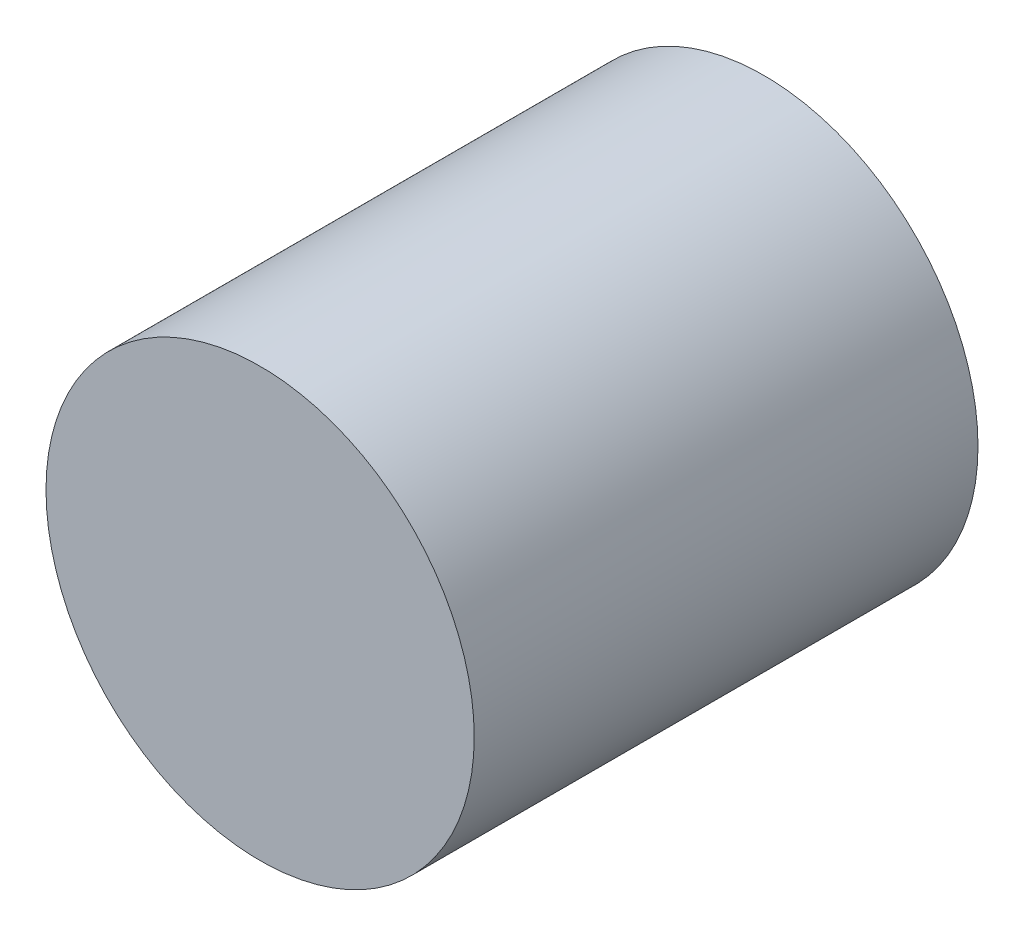
ISO-10303-21;
HEADER;
FILE_DESCRIPTION(('STEP AP214'),'2;1');
FILE_NAME('part.step','',(''),(''),'','','');
FILE_SCHEMA(('AUTOMOTIVE_DESIGN { 1 0 10303 214 1 1 1 1 }'));
ENDSEC;
DATA;
#1=APPLICATION_CONTEXT('core data for automotive mechanical design processes');
#2=APPLICATION_PROTOCOL_DEFINITION('international standard','automotive_design',2000,#1);
#3=PRODUCT_CONTEXT('',#1,'mechanical');
#4=PRODUCT('Part','Part','',(#3));
#5=PRODUCT_RELATED_PRODUCT_CATEGORY('part','',(#4));
#6=PRODUCT_DEFINITION_FORMATION('','',#4);
#7=PRODUCT_DEFINITION_CONTEXT('part definition',#1,'design');
#8=PRODUCT_DEFINITION('design','',#6,#7);
#9=PRODUCT_DEFINITION_SHAPE('','',#8);
#10=(LENGTH_UNIT() NAMED_UNIT(*) SI_UNIT(.MILLI.,.METRE.));
#11=(NAMED_UNIT(*) PLANE_ANGLE_UNIT() SI_UNIT($,.RADIAN.));
#12=(NAMED_UNIT(*) SI_UNIT($,.STERADIAN.) SOLID_ANGLE_UNIT());
#13=UNCERTAINTY_MEASURE_WITH_UNIT(LENGTH_MEASURE(1.E-05),#10,'distance_accuracy_value','');
#14=(GEOMETRIC_REPRESENTATION_CONTEXT(3) GLOBAL_UNCERTAINTY_ASSIGNED_CONTEXT((#13)) GLOBAL_UNIT_ASSIGNED_CONTEXT((#10,
#11,#12)) REPRESENTATION_CONTEXT('',''));
#15=CARTESIAN_POINT('',(0.,0.,0.));
#16=DIRECTION('',(0.,0.,1.));
#17=DIRECTION('',(1.,0.,0.));
#18=AXIS2_PLACEMENT_3D('',#15,#16,#17);
#19=CARTESIAN_POINT('',(0.,0.,0.));
#20=DIRECTION('',(0.,0.,1.));
#21=DIRECTION('',(1.,0.,0.));
#22=AXIS2_PLACEMENT_3D('',#19,#20,#21);
#23=PLANE('',#22);
#24=CARTESIAN_POINT('',(0.,65.,0.));
#25=DIRECTION('',(0.,0.,1.));
#26=DIRECTION('',(1.,0.,0.));
#27=AXIS2_PLACEMENT_3D('',#24,#25,#26);
#28=CIRCLE('',#27,5.1);
#29=CARTESIAN_POINT('',(5.1,65.,0.));
#30=VERTEX_POINT('',#29);
#31=EDGE_CURVE('E11',#30,#30,#28,.T.);
#32=ORIENTED_EDGE('',*,*,#31,.F.);
#33=EDGE_LOOP('',(#32));
#34=FACE_BOUND('',#33,.T.);
#35=ADVANCED_FACE('F40',(#34),#23,.F.);
#36=CARTESIAN_POINT('',(0.,65.,0.));
#37=DIRECTION('',(0.,0.,1.));
#38=DIRECTION('',(1.,0.,0.));
#39=AXIS2_PLACEMENT_3D('',#36,#37,#38);
#40=CYLINDRICAL_SURFACE('',#39,5.1);
#41=ORIENTED_EDGE('',*,*,#31,.T.);
#42=EDGE_LOOP('',(#41));
#43=FACE_BOUND('',#42,.T.);
#44=CARTESIAN_POINT('',(0.,65.,12.));
#45=DIRECTION('',(0.,0.,1.));
#46=DIRECTION('',(1.,0.,0.));
#47=AXIS2_PLACEMENT_3D('',#44,#45,#46);
#48=CIRCLE('',#47,5.1);
#49=CARTESIAN_POINT('',(5.1,65.,12.));
#50=VERTEX_POINT('',#49);
#51=EDGE_CURVE('E43',#50,#50,#48,.T.);
#52=ORIENTED_EDGE('',*,*,#51,.F.);
#53=EDGE_LOOP('',(#52));
#54=FACE_BOUND('',#53,.T.);
#55=ADVANCED_FACE('F54',(#43,#54),#40,.T.);
#56=CARTESIAN_POINT('',(0.,0.,12.));
#57=DIRECTION('',(0.,0.,1.));
#58=DIRECTION('',(1.,0.,0.));
#59=AXIS2_PLACEMENT_3D('',#56,#57,#58);
#60=PLANE('',#59);
#61=ORIENTED_EDGE('',*,*,#51,.T.);
#62=EDGE_LOOP('',(#61));
#63=FACE_BOUND('',#62,.T.);
#64=ADVANCED_FACE('F52',(#63),#60,.T.);
#65=CLOSED_SHELL('',(#35,#55,#64));
#66=MANIFOLD_SOLID_BREP('B2',#65);
#67=ADVANCED_BREP_SHAPE_REPRESENTATION('',(#18,#66),#14);
#68=SHAPE_DEFINITION_REPRESENTATION(#9,#67);
ENDSEC;
END-ISO-10303-21;
